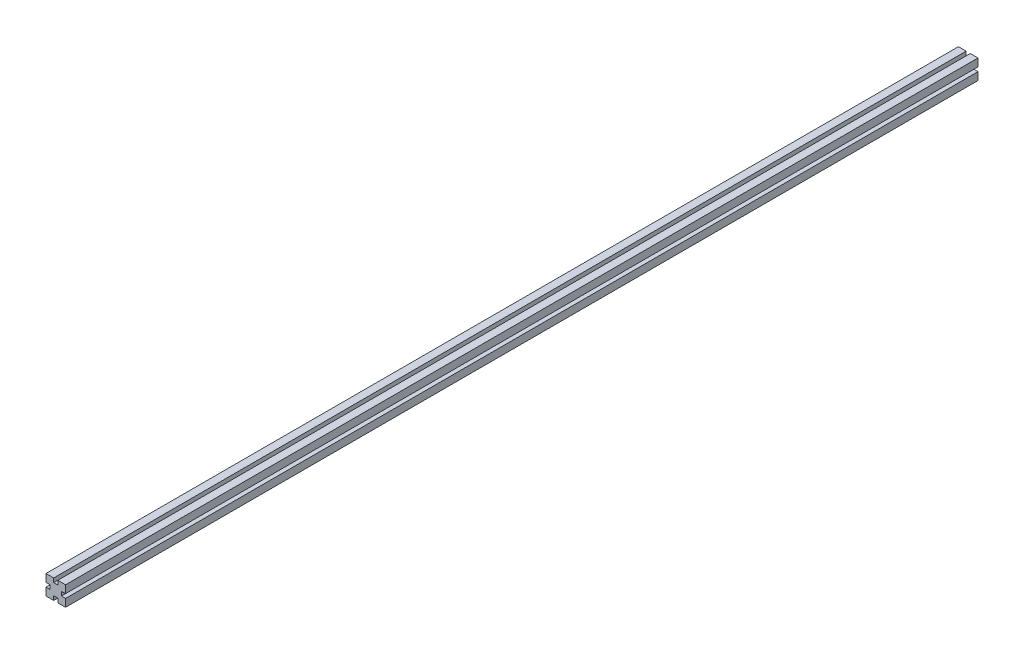
ISO-10303-21;
HEADER;
FILE_DESCRIPTION(('STEP AP214'),'2;1');
FILE_NAME('part.step','',(''),(''),'','','');
FILE_SCHEMA(('AUTOMOTIVE_DESIGN { 1 0 10303 214 1 1 1 1 }'));
ENDSEC;
DATA;
#1=APPLICATION_CONTEXT('core data for automotive mechanical design processes');
#2=APPLICATION_PROTOCOL_DEFINITION('international standard','automotive_design',2000,#1);
#3=PRODUCT_CONTEXT('',#1,'mechanical');
#4=PRODUCT('Part','Part','',(#3));
#5=PRODUCT_RELATED_PRODUCT_CATEGORY('part','',(#4));
#6=PRODUCT_DEFINITION_FORMATION('','',#4);
#7=PRODUCT_DEFINITION_CONTEXT('part definition',#1,'design');
#8=PRODUCT_DEFINITION('design','',#6,#7);
#9=PRODUCT_DEFINITION_SHAPE('','',#8);
#10=(LENGTH_UNIT() NAMED_UNIT(*) SI_UNIT(.MILLI.,.METRE.));
#11=(NAMED_UNIT(*) PLANE_ANGLE_UNIT() SI_UNIT($,.RADIAN.));
#12=(NAMED_UNIT(*) SI_UNIT($,.STERADIAN.) SOLID_ANGLE_UNIT());
#13=UNCERTAINTY_MEASURE_WITH_UNIT(LENGTH_MEASURE(1.E-05),#10,'distance_accuracy_value','');
#14=(GEOMETRIC_REPRESENTATION_CONTEXT(3) GLOBAL_UNCERTAINTY_ASSIGNED_CONTEXT((#13)) GLOBAL_UNIT_ASSIGNED_CONTEXT((#10,
#11,#12)) REPRESENTATION_CONTEXT('',''));
#15=CARTESIAN_POINT('',(0.,0.,0.));
#16=DIRECTION('',(0.,0.,1.));
#17=DIRECTION('',(1.,0.,0.));
#18=AXIS2_PLACEMENT_3D('',#15,#16,#17);
#19=CARTESIAN_POINT('',(-19.05,-4.,1778.));
#20=DIRECTION('',(1.,0.,0.));
#21=DIRECTION('',(0.,0.,-1.));
#22=AXIS2_PLACEMENT_3D('',#19,#20,#21);
#23=PLANE('',#22);
#24=DIRECTION('',(0.,-1.,0.));
#25=VECTOR('',#24,1.);
#26=CARTESIAN_POINT('',(-19.05,-4.,0.));
#27=LINE('',#26,#25);
#28=CARTESIAN_POINT('',(-19.05,-4.,0.));
#29=VERTEX_POINT('',#28);
#30=CARTESIAN_POINT('',(-19.05,-19.05,0.));
#31=VERTEX_POINT('',#30);
#32=EDGE_CURVE('E207',#29,#31,#27,.T.);
#33=ORIENTED_EDGE('',*,*,#32,.T.);
#34=DIRECTION('',(0.,0.,-1.));
#35=VECTOR('',#34,1.);
#36=CARTESIAN_POINT('',(-19.05,-19.05,1778.));
#37=LINE('',#36,#35);
#38=CARTESIAN_POINT('',(-19.05,-19.05,1778.));
#39=VERTEX_POINT('',#38);
#40=EDGE_CURVE('E11',#39,#31,#37,.T.);
#41=ORIENTED_EDGE('',*,*,#40,.F.);
#42=DIRECTION('',(0.,-1.,0.));
#43=VECTOR('',#42,1.);
#44=CARTESIAN_POINT('',(-19.05,-4.,1778.));
#45=LINE('',#44,#43);
#46=CARTESIAN_POINT('',(-19.05,-4.,1778.));
#47=VERTEX_POINT('',#46);
#48=EDGE_CURVE('E245',#47,#39,#45,.T.);
#49=ORIENTED_EDGE('',*,*,#48,.F.);
#50=DIRECTION('',(0.,0.,-1.));
#51=VECTOR('',#50,1.);
#52=CARTESIAN_POINT('',(-19.05,-4.,1778.));
#53=LINE('',#52,#51);
#54=EDGE_CURVE('E203',#47,#29,#53,.T.);
#55=ORIENTED_EDGE('',*,*,#54,.T.);
#56=EDGE_LOOP('',(#33,#41,#49,#55));
#57=FACE_BOUND('',#56,.T.);
#58=ADVANCED_FACE('F39',(#57),#23,.F.);
#59=CARTESIAN_POINT('',(-19.05,-19.05,1778.));
#60=DIRECTION('',(0.,1.,0.));
#61=DIRECTION('',(0.,0.,1.));
#62=AXIS2_PLACEMENT_3D('',#59,#60,#61);
#63=PLANE('',#62);
#64=DIRECTION('',(1.,0.,0.));
#65=VECTOR('',#64,1.);
#66=CARTESIAN_POINT('',(-19.05,-19.05,0.));
#67=LINE('',#66,#65);
#68=CARTESIAN_POINT('',(-4.,-19.05,0.));
#69=VERTEX_POINT('',#68);
#70=EDGE_CURVE('E210',#31,#69,#67,.T.);
#71=ORIENTED_EDGE('',*,*,#70,.T.);
#72=DIRECTION('',(0.,0.,-1.));
#73=VECTOR('',#72,1.);
#74=CARTESIAN_POINT('',(-4.,-19.05,1778.));
#75=LINE('',#74,#73);
#76=CARTESIAN_POINT('',(-4.,-19.05,1778.));
#77=VERTEX_POINT('',#76);
#78=EDGE_CURVE('E47',#77,#69,#75,.T.);
#79=ORIENTED_EDGE('',*,*,#78,.F.);
#80=DIRECTION('',(1.,0.,0.));
#81=VECTOR('',#80,1.);
#82=CARTESIAN_POINT('',(-19.05,-19.05,1778.));
#83=LINE('',#82,#81);
#84=EDGE_CURVE('E134',#39,#77,#83,.T.);
#85=ORIENTED_EDGE('',*,*,#84,.F.);
#86=ORIENTED_EDGE('',*,*,#40,.T.);
#87=EDGE_LOOP('',(#71,#79,#85,#86));
#88=FACE_BOUND('',#87,.T.);
#89=ADVANCED_FACE('F363',(#88),#63,.F.);
#90=CARTESIAN_POINT('',(-4.,-19.05,1778.));
#91=DIRECTION('',(-1.,0.,0.));
#92=DIRECTION('',(0.,0.,1.));
#93=AXIS2_PLACEMENT_3D('',#90,#91,#92);
#94=PLANE('',#93);
#95=DIRECTION('',(0.,1.,0.));
#96=VECTOR('',#95,1.);
#97=CARTESIAN_POINT('',(-4.,-19.05,0.));
#98=LINE('',#97,#96);
#99=CARTESIAN_POINT('',(-4.,-11.05,0.));
#100=VERTEX_POINT('',#99);
#101=EDGE_CURVE('E212',#69,#100,#98,.T.);
#102=ORIENTED_EDGE('',*,*,#101,.T.);
#103=DIRECTION('',(0.,0.,-1.));
#104=VECTOR('',#103,1.);
#105=CARTESIAN_POINT('',(-4.,-11.05,1778.));
#106=LINE('',#105,#104);
#107=CARTESIAN_POINT('',(-4.,-11.05,1778.));
#108=VERTEX_POINT('',#107);
#109=EDGE_CURVE('E288',#108,#100,#106,.T.);
#110=ORIENTED_EDGE('',*,*,#109,.F.);
#111=DIRECTION('',(0.,1.,0.));
#112=VECTOR('',#111,1.);
#113=CARTESIAN_POINT('',(-4.,-19.05,1778.));
#114=LINE('',#113,#112);
#115=EDGE_CURVE('E296',#77,#108,#114,.T.);
#116=ORIENTED_EDGE('',*,*,#115,.F.);
#117=ORIENTED_EDGE('',*,*,#78,.T.);
#118=EDGE_LOOP('',(#102,#110,#116,#117));
#119=FACE_BOUND('',#118,.T.);
#120=ADVANCED_FACE('F294',(#119),#94,.F.);
#121=CARTESIAN_POINT('',(-4.,-11.05,1778.));
#122=DIRECTION('',(0.,1.,0.));
#123=DIRECTION('',(0.,0.,1.));
#124=AXIS2_PLACEMENT_3D('',#121,#122,#123);
#125=PLANE('',#124);
#126=DIRECTION('',(1.,0.,0.));
#127=VECTOR('',#126,1.);
#128=CARTESIAN_POINT('',(-4.,-11.05,0.));
#129=LINE('',#128,#127);
#130=CARTESIAN_POINT('',(4.,-11.05,0.));
#131=VERTEX_POINT('',#130);
#132=EDGE_CURVE('E214',#100,#131,#129,.T.);
#133=ORIENTED_EDGE('',*,*,#132,.T.);
#134=DIRECTION('',(0.,0.,-1.));
#135=VECTOR('',#134,1.);
#136=CARTESIAN_POINT('',(4.,-11.05,1778.));
#137=LINE('',#136,#135);
#138=CARTESIAN_POINT('',(4.,-11.05,1778.));
#139=VERTEX_POINT('',#138);
#140=EDGE_CURVE('E285',#139,#131,#137,.T.);
#141=ORIENTED_EDGE('',*,*,#140,.F.);
#142=DIRECTION('',(1.,0.,0.));
#143=VECTOR('',#142,1.);
#144=CARTESIAN_POINT('',(-4.,-11.05,1778.));
#145=LINE('',#144,#143);
#146=EDGE_CURVE('E314',#108,#139,#145,.T.);
#147=ORIENTED_EDGE('',*,*,#146,.F.);
#148=ORIENTED_EDGE('',*,*,#109,.T.);
#149=EDGE_LOOP('',(#133,#141,#147,#148));
#150=FACE_BOUND('',#149,.T.);
#151=ADVANCED_FACE('F305',(#150),#125,.F.);
#152=CARTESIAN_POINT('',(4.,-11.05,1778.));
#153=DIRECTION('',(1.,0.,0.));
#154=DIRECTION('',(0.,0.,-1.));
#155=AXIS2_PLACEMENT_3D('',#152,#153,#154);
#156=PLANE('',#155);
#157=DIRECTION('',(0.,-1.,0.));
#158=VECTOR('',#157,1.);
#159=CARTESIAN_POINT('',(4.,-11.05,0.));
#160=LINE('',#159,#158);
#161=CARTESIAN_POINT('',(4.,-19.05,0.));
#162=VERTEX_POINT('',#161);
#163=EDGE_CURVE('E216',#131,#162,#160,.T.);
#164=ORIENTED_EDGE('',*,*,#163,.T.);
#165=DIRECTION('',(0.,0.,-1.));
#166=VECTOR('',#165,1.);
#167=CARTESIAN_POINT('',(4.,-19.05,1778.));
#168=LINE('',#167,#166);
#169=CARTESIAN_POINT('',(4.,-19.05,1778.));
#170=VERTEX_POINT('',#169);
#171=EDGE_CURVE('E282',#170,#162,#168,.T.);
#172=ORIENTED_EDGE('',*,*,#171,.F.);
#173=DIRECTION('',(0.,-1.,0.));
#174=VECTOR('',#173,1.);
#175=CARTESIAN_POINT('',(4.,-11.05,1778.));
#176=LINE('',#175,#174);
#177=EDGE_CURVE('E311',#139,#170,#176,.T.);
#178=ORIENTED_EDGE('',*,*,#177,.F.);
#179=ORIENTED_EDGE('',*,*,#140,.T.);
#180=EDGE_LOOP('',(#164,#172,#178,#179));
#181=FACE_BOUND('',#180,.T.);
#182=ADVANCED_FACE('F309',(#181),#156,.F.);
#183=CARTESIAN_POINT('',(4.,-19.05,1778.));
#184=DIRECTION('',(0.,1.,0.));
#185=DIRECTION('',(0.,0.,1.));
#186=AXIS2_PLACEMENT_3D('',#183,#184,#185);
#187=PLANE('',#186);
#188=DIRECTION('',(1.,0.,0.));
#189=VECTOR('',#188,1.);
#190=CARTESIAN_POINT('',(4.,-19.05,0.));
#191=LINE('',#190,#189);
#192=CARTESIAN_POINT('',(19.05,-19.05,0.));
#193=VERTEX_POINT('',#192);
#194=EDGE_CURVE('E218',#162,#193,#191,.T.);
#195=ORIENTED_EDGE('',*,*,#194,.T.);
#196=DIRECTION('',(0.,0.,-1.));
#197=VECTOR('',#196,1.);
#198=CARTESIAN_POINT('',(19.05,-19.05,1778.));
#199=LINE('',#198,#197);
#200=CARTESIAN_POINT('',(19.05,-19.05,1778.));
#201=VERTEX_POINT('',#200);
#202=EDGE_CURVE('E279',#201,#193,#199,.T.);
#203=ORIENTED_EDGE('',*,*,#202,.F.);
#204=DIRECTION('',(1.,0.,0.));
#205=VECTOR('',#204,1.);
#206=CARTESIAN_POINT('',(4.,-19.05,1778.));
#207=LINE('',#206,#205);
#208=EDGE_CURVE('E313',#170,#201,#207,.T.);
#209=ORIENTED_EDGE('',*,*,#208,.F.);
#210=ORIENTED_EDGE('',*,*,#171,.T.);
#211=EDGE_LOOP('',(#195,#203,#209,#210));
#212=FACE_BOUND('',#211,.T.);
#213=ADVANCED_FACE('F376',(#212),#187,.F.);
#214=CARTESIAN_POINT('',(19.05,-19.05,1778.));
#215=DIRECTION('',(-1.,0.,0.));
#216=DIRECTION('',(0.,0.,1.));
#217=AXIS2_PLACEMENT_3D('',#214,#215,#216);
#218=PLANE('',#217);
#219=DIRECTION('',(0.,1.,0.));
#220=VECTOR('',#219,1.);
#221=CARTESIAN_POINT('',(19.05,-19.05,0.));
#222=LINE('',#221,#220);
#223=CARTESIAN_POINT('',(19.05,-4.,0.));
#224=VERTEX_POINT('',#223);
#225=EDGE_CURVE('E220',#193,#224,#222,.T.);
#226=ORIENTED_EDGE('',*,*,#225,.T.);
#227=DIRECTION('',(0.,0.,-1.));
#228=VECTOR('',#227,1.);
#229=CARTESIAN_POINT('',(19.05,-4.,1778.));
#230=LINE('',#229,#228);
#231=CARTESIAN_POINT('',(19.05,-4.,1778.));
#232=VERTEX_POINT('',#231);
#233=EDGE_CURVE('E276',#232,#224,#230,.T.);
#234=ORIENTED_EDGE('',*,*,#233,.F.);
#235=DIRECTION('',(0.,1.,0.));
#236=VECTOR('',#235,1.);
#237=CARTESIAN_POINT('',(19.05,-19.05,1778.));
#238=LINE('',#237,#236);
#239=EDGE_CURVE('E316',#201,#232,#238,.T.);
#240=ORIENTED_EDGE('',*,*,#239,.F.);
#241=ORIENTED_EDGE('',*,*,#202,.T.);
#242=EDGE_LOOP('',(#226,#234,#240,#241));
#243=FACE_BOUND('',#242,.T.);
#244=ADVANCED_FACE('F379',(#243),#218,.F.);
#245=CARTESIAN_POINT('',(19.05,-4.,1778.));
#246=DIRECTION('',(0.,-1.,0.));
#247=DIRECTION('',(0.,0.,-1.));
#248=AXIS2_PLACEMENT_3D('',#245,#246,#247);
#249=PLANE('',#248);
#250=DIRECTION('',(-1.,0.,0.));
#251=VECTOR('',#250,1.);
#252=CARTESIAN_POINT('',(19.05,-4.,0.));
#253=LINE('',#252,#251);
#254=CARTESIAN_POINT('',(11.05,-4.,0.));
#255=VERTEX_POINT('',#254);
#256=EDGE_CURVE('E222',#224,#255,#253,.T.);
#257=ORIENTED_EDGE('',*,*,#256,.T.);
#258=DIRECTION('',(0.,0.,-1.));
#259=VECTOR('',#258,1.);
#260=CARTESIAN_POINT('',(11.05,-4.,1778.));
#261=LINE('',#260,#259);
#262=CARTESIAN_POINT('',(11.05,-4.,1778.));
#263=VERTEX_POINT('',#262);
#264=EDGE_CURVE('E273',#263,#255,#261,.T.);
#265=ORIENTED_EDGE('',*,*,#264,.F.);
#266=DIRECTION('',(-1.,0.,0.));
#267=VECTOR('',#266,1.);
#268=CARTESIAN_POINT('',(19.05,-4.,1778.));
#269=LINE('',#268,#267);
#270=EDGE_CURVE('E322',#232,#263,#269,.T.);
#271=ORIENTED_EDGE('',*,*,#270,.F.);
#272=ORIENTED_EDGE('',*,*,#233,.T.);
#273=EDGE_LOOP('',(#257,#265,#271,#272));
#274=FACE_BOUND('',#273,.T.);
#275=ADVANCED_FACE('F383',(#274),#249,.F.);
#276=CARTESIAN_POINT('',(11.05,-4.,1778.));
#277=DIRECTION('',(-1.,0.,0.));
#278=DIRECTION('',(0.,0.,1.));
#279=AXIS2_PLACEMENT_3D('',#276,#277,#278);
#280=PLANE('',#279);
#281=DIRECTION('',(0.,1.,0.));
#282=VECTOR('',#281,1.);
#283=CARTESIAN_POINT('',(11.05,-4.,0.));
#284=LINE('',#283,#282);
#285=CARTESIAN_POINT('',(11.05,4.,0.));
#286=VERTEX_POINT('',#285);
#287=EDGE_CURVE('E224',#255,#286,#284,.T.);
#288=ORIENTED_EDGE('',*,*,#287,.T.);
#289=DIRECTION('',(0.,0.,-1.));
#290=VECTOR('',#289,1.);
#291=CARTESIAN_POINT('',(11.05,4.,1778.));
#292=LINE('',#291,#290);
#293=CARTESIAN_POINT('',(11.05,4.,1778.));
#294=VERTEX_POINT('',#293);
#295=EDGE_CURVE('E270',#294,#286,#292,.T.);
#296=ORIENTED_EDGE('',*,*,#295,.F.);
#297=DIRECTION('',(0.,1.,0.));
#298=VECTOR('',#297,1.);
#299=CARTESIAN_POINT('',(11.05,-4.,1778.));
#300=LINE('',#299,#298);
#301=EDGE_CURVE('E324',#263,#294,#300,.T.);
#302=ORIENTED_EDGE('',*,*,#301,.F.);
#303=ORIENTED_EDGE('',*,*,#264,.T.);
#304=EDGE_LOOP('',(#288,#296,#302,#303));
#305=FACE_BOUND('',#304,.T.);
#306=ADVANCED_FACE('F387',(#305),#280,.F.);
#307=CARTESIAN_POINT('',(11.05,4.,1778.));
#308=DIRECTION('',(0.,1.,0.));
#309=DIRECTION('',(0.,0.,1.));
#310=AXIS2_PLACEMENT_3D('',#307,#308,#309);
#311=PLANE('',#310);
#312=DIRECTION('',(1.,0.,0.));
#313=VECTOR('',#312,1.);
#314=CARTESIAN_POINT('',(11.05,4.,0.));
#315=LINE('',#314,#313);
#316=CARTESIAN_POINT('',(19.05,4.,0.));
#317=VERTEX_POINT('',#316);
#318=EDGE_CURVE('E226',#286,#317,#315,.T.);
#319=ORIENTED_EDGE('',*,*,#318,.T.);
#320=DIRECTION('',(0.,0.,-1.));
#321=VECTOR('',#320,1.);
#322=CARTESIAN_POINT('',(19.05,4.,1778.));
#323=LINE('',#322,#321);
#324=CARTESIAN_POINT('',(19.05,4.,1778.));
#325=VERTEX_POINT('',#324);
#326=EDGE_CURVE('E267',#325,#317,#323,.T.);
#327=ORIENTED_EDGE('',*,*,#326,.F.);
#328=DIRECTION('',(1.,0.,0.));
#329=VECTOR('',#328,1.);
#330=CARTESIAN_POINT('',(11.05,4.,1778.));
#331=LINE('',#330,#329);
#332=EDGE_CURVE('E326',#294,#325,#331,.T.);
#333=ORIENTED_EDGE('',*,*,#332,.F.);
#334=ORIENTED_EDGE('',*,*,#295,.T.);
#335=EDGE_LOOP('',(#319,#327,#333,#334));
#336=FACE_BOUND('',#335,.T.);
#337=ADVANCED_FACE('F391',(#336),#311,.F.);
#338=CARTESIAN_POINT('',(19.05,4.,1778.));
#339=DIRECTION('',(-1.,0.,0.));
#340=DIRECTION('',(0.,0.,1.));
#341=AXIS2_PLACEMENT_3D('',#338,#339,#340);
#342=PLANE('',#341);
#343=DIRECTION('',(0.,1.,0.));
#344=VECTOR('',#343,1.);
#345=CARTESIAN_POINT('',(19.05,4.,0.));
#346=LINE('',#345,#344);
#347=CARTESIAN_POINT('',(19.05,19.05,0.));
#348=VERTEX_POINT('',#347);
#349=EDGE_CURVE('E228',#317,#348,#346,.T.);
#350=ORIENTED_EDGE('',*,*,#349,.T.);
#351=DIRECTION('',(0.,0.,-1.));
#352=VECTOR('',#351,1.);
#353=CARTESIAN_POINT('',(19.05,19.05,1778.));
#354=LINE('',#353,#352);
#355=CARTESIAN_POINT('',(19.05,19.05,1778.));
#356=VERTEX_POINT('',#355);
#357=EDGE_CURVE('E264',#356,#348,#354,.T.);
#358=ORIENTED_EDGE('',*,*,#357,.F.);
#359=DIRECTION('',(0.,1.,0.));
#360=VECTOR('',#359,1.);
#361=CARTESIAN_POINT('',(19.05,4.,1778.));
#362=LINE('',#361,#360);
#363=EDGE_CURVE('E328',#325,#356,#362,.T.);
#364=ORIENTED_EDGE('',*,*,#363,.F.);
#365=ORIENTED_EDGE('',*,*,#326,.T.);
#366=EDGE_LOOP('',(#350,#358,#364,#365));
#367=FACE_BOUND('',#366,.T.);
#368=ADVANCED_FACE('F395',(#367),#342,.F.);
#369=CARTESIAN_POINT('',(19.05,19.05,1778.));
#370=DIRECTION('',(0.,-1.,0.));
#371=DIRECTION('',(0.,0.,-1.));
#372=AXIS2_PLACEMENT_3D('',#369,#370,#371);
#373=PLANE('',#372);
#374=DIRECTION('',(-1.,0.,0.));
#375=VECTOR('',#374,1.);
#376=CARTESIAN_POINT('',(19.05,19.05,0.));
#377=LINE('',#376,#375);
#378=CARTESIAN_POINT('',(4.,19.05,0.));
#379=VERTEX_POINT('',#378);
#380=EDGE_CURVE('E230',#348,#379,#377,.T.);
#381=ORIENTED_EDGE('',*,*,#380,.T.);
#382=DIRECTION('',(0.,0.,-1.));
#383=VECTOR('',#382,1.);
#384=CARTESIAN_POINT('',(4.,19.05,1778.));
#385=LINE('',#384,#383);
#386=CARTESIAN_POINT('',(4.,19.05,1778.));
#387=VERTEX_POINT('',#386);
#388=EDGE_CURVE('E261',#387,#379,#385,.T.);
#389=ORIENTED_EDGE('',*,*,#388,.F.);
#390=DIRECTION('',(-1.,0.,0.));
#391=VECTOR('',#390,1.);
#392=CARTESIAN_POINT('',(19.05,19.05,1778.));
#393=LINE('',#392,#391);
#394=EDGE_CURVE('E330',#356,#387,#393,.T.);
#395=ORIENTED_EDGE('',*,*,#394,.F.);
#396=ORIENTED_EDGE('',*,*,#357,.T.);
#397=EDGE_LOOP('',(#381,#389,#395,#396));
#398=FACE_BOUND('',#397,.T.);
#399=ADVANCED_FACE('F399',(#398),#373,.F.);
#400=CARTESIAN_POINT('',(4.,19.05,1778.));
#401=DIRECTION('',(1.,0.,0.));
#402=DIRECTION('',(0.,0.,-1.));
#403=AXIS2_PLACEMENT_3D('',#400,#401,#402);
#404=PLANE('',#403);
#405=DIRECTION('',(0.,-1.,0.));
#406=VECTOR('',#405,1.);
#407=CARTESIAN_POINT('',(4.,19.05,0.));
#408=LINE('',#407,#406);
#409=CARTESIAN_POINT('',(4.,11.05,0.));
#410=VERTEX_POINT('',#409);
#411=EDGE_CURVE('E232',#379,#410,#408,.T.);
#412=ORIENTED_EDGE('',*,*,#411,.T.);
#413=DIRECTION('',(0.,0.,-1.));
#414=VECTOR('',#413,1.);
#415=CARTESIAN_POINT('',(4.,11.05,1778.));
#416=LINE('',#415,#414);
#417=CARTESIAN_POINT('',(4.,11.05,1778.));
#418=VERTEX_POINT('',#417);
#419=EDGE_CURVE('E258',#418,#410,#416,.T.);
#420=ORIENTED_EDGE('',*,*,#419,.F.);
#421=DIRECTION('',(0.,-1.,0.));
#422=VECTOR('',#421,1.);
#423=CARTESIAN_POINT('',(4.,19.05,1778.));
#424=LINE('',#423,#422);
#425=EDGE_CURVE('E332',#387,#418,#424,.T.);
#426=ORIENTED_EDGE('',*,*,#425,.F.);
#427=ORIENTED_EDGE('',*,*,#388,.T.);
#428=EDGE_LOOP('',(#412,#420,#426,#427));
#429=FACE_BOUND('',#428,.T.);
#430=ADVANCED_FACE('F403',(#429),#404,.F.);
#431=CARTESIAN_POINT('',(4.,11.05,1778.));
#432=DIRECTION('',(0.,-1.,0.));
#433=DIRECTION('',(0.,0.,-1.));
#434=AXIS2_PLACEMENT_3D('',#431,#432,#433);
#435=PLANE('',#434);
#436=DIRECTION('',(-1.,0.,0.));
#437=VECTOR('',#436,1.);
#438=CARTESIAN_POINT('',(4.,11.05,0.));
#439=LINE('',#438,#437);
#440=CARTESIAN_POINT('',(-4.,11.05,0.));
#441=VERTEX_POINT('',#440);
#442=EDGE_CURVE('E234',#410,#441,#439,.T.);
#443=ORIENTED_EDGE('',*,*,#442,.T.);
#444=DIRECTION('',(0.,0.,-1.));
#445=VECTOR('',#444,1.);
#446=CARTESIAN_POINT('',(-4.,11.05,1778.));
#447=LINE('',#446,#445);
#448=CARTESIAN_POINT('',(-4.,11.05,1778.));
#449=VERTEX_POINT('',#448);
#450=EDGE_CURVE('E255',#449,#441,#447,.T.);
#451=ORIENTED_EDGE('',*,*,#450,.F.);
#452=DIRECTION('',(-1.,0.,0.));
#453=VECTOR('',#452,1.);
#454=CARTESIAN_POINT('',(4.,11.05,1778.));
#455=LINE('',#454,#453);
#456=EDGE_CURVE('E334',#418,#449,#455,.T.);
#457=ORIENTED_EDGE('',*,*,#456,.F.);
#458=ORIENTED_EDGE('',*,*,#419,.T.);
#459=EDGE_LOOP('',(#443,#451,#457,#458));
#460=FACE_BOUND('',#459,.T.);
#461=ADVANCED_FACE('F407',(#460),#435,.F.);
#462=CARTESIAN_POINT('',(-4.,11.05,1778.));
#463=DIRECTION('',(-1.,0.,0.));
#464=DIRECTION('',(0.,0.,1.));
#465=AXIS2_PLACEMENT_3D('',#462,#463,#464);
#466=PLANE('',#465);
#467=DIRECTION('',(0.,1.,0.));
#468=VECTOR('',#467,1.);
#469=CARTESIAN_POINT('',(-4.,11.05,0.));
#470=LINE('',#469,#468);
#471=CARTESIAN_POINT('',(-4.,19.05,0.));
#472=VERTEX_POINT('',#471);
#473=EDGE_CURVE('E236',#441,#472,#470,.T.);
#474=ORIENTED_EDGE('',*,*,#473,.T.);
#475=DIRECTION('',(0.,0.,-1.));
#476=VECTOR('',#475,1.);
#477=CARTESIAN_POINT('',(-4.,19.05,1778.));
#478=LINE('',#477,#476);
#479=CARTESIAN_POINT('',(-4.,19.05,1778.));
#480=VERTEX_POINT('',#479);
#481=EDGE_CURVE('E252',#480,#472,#478,.T.);
#482=ORIENTED_EDGE('',*,*,#481,.F.);
#483=DIRECTION('',(0.,1.,0.));
#484=VECTOR('',#483,1.);
#485=CARTESIAN_POINT('',(-4.,11.05,1778.));
#486=LINE('',#485,#484);
#487=EDGE_CURVE('E336',#449,#480,#486,.T.);
#488=ORIENTED_EDGE('',*,*,#487,.F.);
#489=ORIENTED_EDGE('',*,*,#450,.T.);
#490=EDGE_LOOP('',(#474,#482,#488,#489));
#491=FACE_BOUND('',#490,.T.);
#492=ADVANCED_FACE('F411',(#491),#466,.F.);
#493=CARTESIAN_POINT('',(-4.,19.05,1778.));
#494=DIRECTION('',(0.,-1.,0.));
#495=DIRECTION('',(0.,0.,-1.));
#496=AXIS2_PLACEMENT_3D('',#493,#494,#495);
#497=PLANE('',#496);
#498=DIRECTION('',(-1.,0.,0.));
#499=VECTOR('',#498,1.);
#500=CARTESIAN_POINT('',(-4.,19.05,0.));
#501=LINE('',#500,#499);
#502=CARTESIAN_POINT('',(-19.05,19.05,0.));
#503=VERTEX_POINT('',#502);
#504=EDGE_CURVE('E238',#472,#503,#501,.T.);
#505=ORIENTED_EDGE('',*,*,#504,.T.);
#506=DIRECTION('',(0.,0.,-1.));
#507=VECTOR('',#506,1.);
#508=CARTESIAN_POINT('',(-19.05,19.05,1778.));
#509=LINE('',#508,#507);
#510=CARTESIAN_POINT('',(-19.05,19.05,1778.));
#511=VERTEX_POINT('',#510);
#512=EDGE_CURVE('E249',#511,#503,#509,.T.);
#513=ORIENTED_EDGE('',*,*,#512,.F.);
#514=DIRECTION('',(-1.,0.,0.));
#515=VECTOR('',#514,1.);
#516=CARTESIAN_POINT('',(-4.,19.05,1778.));
#517=LINE('',#516,#515);
#518=EDGE_CURVE('E338',#480,#511,#517,.T.);
#519=ORIENTED_EDGE('',*,*,#518,.F.);
#520=ORIENTED_EDGE('',*,*,#481,.T.);
#521=EDGE_LOOP('',(#505,#513,#519,#520));
#522=FACE_BOUND('',#521,.T.);
#523=ADVANCED_FACE('F344',(#522),#497,.F.);
#524=CARTESIAN_POINT('',(-19.05,19.05,1778.));
#525=DIRECTION('',(1.,0.,0.));
#526=DIRECTION('',(0.,0.,-1.));
#527=AXIS2_PLACEMENT_3D('',#524,#525,#526);
#528=PLANE('',#527);
#529=DIRECTION('',(0.,-1.,0.));
#530=VECTOR('',#529,1.);
#531=CARTESIAN_POINT('',(-19.05,19.05,0.));
#532=LINE('',#531,#530);
#533=CARTESIAN_POINT('',(-19.05,4.,0.));
#534=VERTEX_POINT('',#533);
#535=EDGE_CURVE('E240',#503,#534,#532,.T.);
#536=ORIENTED_EDGE('',*,*,#535,.T.);
#537=DIRECTION('',(0.,0.,-1.));
#538=VECTOR('',#537,1.);
#539=CARTESIAN_POINT('',(-19.05,4.,1778.));
#540=LINE('',#539,#538);
#541=CARTESIAN_POINT('',(-19.05,4.,1778.));
#542=VERTEX_POINT('',#541);
#543=EDGE_CURVE('E198',#542,#534,#540,.T.);
#544=ORIENTED_EDGE('',*,*,#543,.F.);
#545=DIRECTION('',(0.,-1.,0.));
#546=VECTOR('',#545,1.);
#547=CARTESIAN_POINT('',(-19.05,19.05,1778.));
#548=LINE('',#547,#546);
#549=EDGE_CURVE('E189',#511,#542,#548,.T.);
#550=ORIENTED_EDGE('',*,*,#549,.F.);
#551=ORIENTED_EDGE('',*,*,#512,.T.);
#552=EDGE_LOOP('',(#536,#544,#550,#551));
#553=FACE_BOUND('',#552,.T.);
#554=ADVANCED_FACE('F348',(#553),#528,.F.);
#555=CARTESIAN_POINT('',(-19.05,4.,1778.));
#556=DIRECTION('',(0.,1.,0.));
#557=DIRECTION('',(0.,0.,1.));
#558=AXIS2_PLACEMENT_3D('',#555,#556,#557);
#559=PLANE('',#558);
#560=DIRECTION('',(1.,0.,0.));
#561=VECTOR('',#560,1.);
#562=CARTESIAN_POINT('',(-19.05,4.,0.));
#563=LINE('',#562,#561);
#564=CARTESIAN_POINT('',(-11.05,4.,0.));
#565=VERTEX_POINT('',#564);
#566=EDGE_CURVE('E197',#534,#565,#563,.T.);
#567=ORIENTED_EDGE('',*,*,#566,.T.);
#568=DIRECTION('',(0.,0.,-1.));
#569=VECTOR('',#568,1.);
#570=CARTESIAN_POINT('',(-11.05,4.,1778.));
#571=LINE('',#570,#569);
#572=CARTESIAN_POINT('',(-11.05,4.,1778.));
#573=VERTEX_POINT('',#572);
#574=EDGE_CURVE('E194',#573,#565,#571,.T.);
#575=ORIENTED_EDGE('',*,*,#574,.F.);
#576=DIRECTION('',(1.,0.,0.));
#577=VECTOR('',#576,1.);
#578=CARTESIAN_POINT('',(-19.05,4.,1778.));
#579=LINE('',#578,#577);
#580=EDGE_CURVE('E183',#542,#573,#579,.T.);
#581=ORIENTED_EDGE('',*,*,#580,.F.);
#582=ORIENTED_EDGE('',*,*,#543,.T.);
#583=EDGE_LOOP('',(#567,#575,#581,#582));
#584=FACE_BOUND('',#583,.T.);
#585=ADVANCED_FACE('F195',(#584),#559,.F.);
#586=CARTESIAN_POINT('',(-11.05,4.,1778.));
#587=DIRECTION('',(1.,0.,0.));
#588=DIRECTION('',(0.,0.,-1.));
#589=AXIS2_PLACEMENT_3D('',#586,#587,#588);
#590=PLANE('',#589);
#591=DIRECTION('',(0.,-1.,0.));
#592=VECTOR('',#591,1.);
#593=CARTESIAN_POINT('',(-11.05,4.,0.));
#594=LINE('',#593,#592);
#595=CARTESIAN_POINT('',(-11.05,-4.,0.));
#596=VERTEX_POINT('',#595);
#597=EDGE_CURVE('E120',#565,#596,#594,.T.);
#598=ORIENTED_EDGE('',*,*,#597,.T.);
#599=DIRECTION('',(0.,0.,-1.));
#600=VECTOR('',#599,1.);
#601=CARTESIAN_POINT('',(-11.05,-4.,1778.));
#602=LINE('',#601,#600);
#603=CARTESIAN_POINT('',(-11.05,-4.,1778.));
#604=VERTEX_POINT('',#603);
#605=EDGE_CURVE('E199',#604,#596,#602,.T.);
#606=ORIENTED_EDGE('',*,*,#605,.F.);
#607=DIRECTION('',(0.,-1.,0.));
#608=VECTOR('',#607,1.);
#609=CARTESIAN_POINT('',(-11.05,4.,1778.));
#610=LINE('',#609,#608);
#611=EDGE_CURVE('E187',#573,#604,#610,.T.);
#612=ORIENTED_EDGE('',*,*,#611,.F.);
#613=ORIENTED_EDGE('',*,*,#574,.T.);
#614=EDGE_LOOP('',(#598,#606,#612,#613));
#615=FACE_BOUND('',#614,.T.);
#616=ADVANCED_FACE('F201',(#615),#590,.F.);
#617=CARTESIAN_POINT('',(-11.05,-4.,1778.));
#618=DIRECTION('',(0.,-1.,0.));
#619=DIRECTION('',(0.,0.,-1.));
#620=AXIS2_PLACEMENT_3D('',#617,#618,#619);
#621=PLANE('',#620);
#622=DIRECTION('',(-1.,0.,0.));
#623=VECTOR('',#622,1.);
#624=CARTESIAN_POINT('',(-11.05,-4.,0.));
#625=LINE('',#624,#623);
#626=EDGE_CURVE('E126',#596,#29,#625,.T.);
#627=ORIENTED_EDGE('',*,*,#626,.T.);
#628=ORIENTED_EDGE('',*,*,#54,.F.);
#629=DIRECTION('',(-1.,0.,0.));
#630=VECTOR('',#629,1.);
#631=CARTESIAN_POINT('',(-11.05,-4.,1778.));
#632=LINE('',#631,#630);
#633=EDGE_CURVE('E55',#604,#47,#632,.T.);
#634=ORIENTED_EDGE('',*,*,#633,.F.);
#635=ORIENTED_EDGE('',*,*,#605,.T.);
#636=EDGE_LOOP('',(#627,#628,#634,#635));
#637=FACE_BOUND('',#636,.T.);
#638=ADVANCED_FACE('F352',(#637),#621,.F.);
#639=CARTESIAN_POINT('',(0.,0.,1778.));
#640=DIRECTION('',(0.,0.,1.));
#641=DIRECTION('',(1.,0.,0.));
#642=AXIS2_PLACEMENT_3D('',#639,#640,#641);
#643=PLANE('',#642);
#644=ORIENTED_EDGE('',*,*,#48,.T.);
#645=ORIENTED_EDGE('',*,*,#84,.T.);
#646=ORIENTED_EDGE('',*,*,#115,.T.);
#647=ORIENTED_EDGE('',*,*,#146,.T.);
#648=ORIENTED_EDGE('',*,*,#177,.T.);
#649=ORIENTED_EDGE('',*,*,#208,.T.);
#650=ORIENTED_EDGE('',*,*,#239,.T.);
#651=ORIENTED_EDGE('',*,*,#270,.T.);
#652=ORIENTED_EDGE('',*,*,#301,.T.);
#653=ORIENTED_EDGE('',*,*,#332,.T.);
#654=ORIENTED_EDGE('',*,*,#363,.T.);
#655=ORIENTED_EDGE('',*,*,#394,.T.);
#656=ORIENTED_EDGE('',*,*,#425,.T.);
#657=ORIENTED_EDGE('',*,*,#456,.T.);
#658=ORIENTED_EDGE('',*,*,#487,.T.);
#659=ORIENTED_EDGE('',*,*,#518,.T.);
#660=ORIENTED_EDGE('',*,*,#549,.T.);
#661=ORIENTED_EDGE('',*,*,#580,.T.);
#662=ORIENTED_EDGE('',*,*,#611,.T.);
#663=ORIENTED_EDGE('',*,*,#633,.T.);
#664=EDGE_LOOP('',(#644,#645,#646,#647,#648,#649,#650,#651,#652,#653,#654,#655,#656,#657,#658,
#659,#660,#661,#662,#663));
#665=FACE_BOUND('',#664,.T.);
#666=ADVANCED_FACE('F185',(#665),#643,.T.);
#667=CARTESIAN_POINT('',(0.,0.,0.));
#668=DIRECTION('',(0.,0.,1.));
#669=DIRECTION('',(1.,0.,0.));
#670=AXIS2_PLACEMENT_3D('',#667,#668,#669);
#671=PLANE('',#670);
#672=ORIENTED_EDGE('',*,*,#32,.F.);
#673=ORIENTED_EDGE('',*,*,#626,.F.);
#674=ORIENTED_EDGE('',*,*,#597,.F.);
#675=ORIENTED_EDGE('',*,*,#566,.F.);
#676=ORIENTED_EDGE('',*,*,#535,.F.);
#677=ORIENTED_EDGE('',*,*,#504,.F.);
#678=ORIENTED_EDGE('',*,*,#473,.F.);
#679=ORIENTED_EDGE('',*,*,#442,.F.);
#680=ORIENTED_EDGE('',*,*,#411,.F.);
#681=ORIENTED_EDGE('',*,*,#380,.F.);
#682=ORIENTED_EDGE('',*,*,#349,.F.);
#683=ORIENTED_EDGE('',*,*,#318,.F.);
#684=ORIENTED_EDGE('',*,*,#287,.F.);
#685=ORIENTED_EDGE('',*,*,#256,.F.);
#686=ORIENTED_EDGE('',*,*,#225,.F.);
#687=ORIENTED_EDGE('',*,*,#194,.F.);
#688=ORIENTED_EDGE('',*,*,#163,.F.);
#689=ORIENTED_EDGE('',*,*,#132,.F.);
#690=ORIENTED_EDGE('',*,*,#101,.F.);
#691=ORIENTED_EDGE('',*,*,#70,.F.);
#692=EDGE_LOOP('',(#672,#673,#674,#675,#676,#677,#678,#679,#680,#681,#682,#683,#684,#685,#686,
#687,#688,#689,#690,#691));
#693=FACE_BOUND('',#692,.T.);
#694=ADVANCED_FACE('F300',(#693),#671,.F.);
#695=CLOSED_SHELL('',(#58,#89,#120,#151,#182,#213,#244,#275,#306,#337,#368,#399,#430,#461,#492,
#523,#554,#585,#616,#638,#666,#694));
#696=MANIFOLD_SOLID_BREP('B2',#695);
#697=ADVANCED_BREP_SHAPE_REPRESENTATION('',(#18,#696),#14);
#698=SHAPE_DEFINITION_REPRESENTATION(#9,#697);
ENDSEC;
END-ISO-10303-21;
